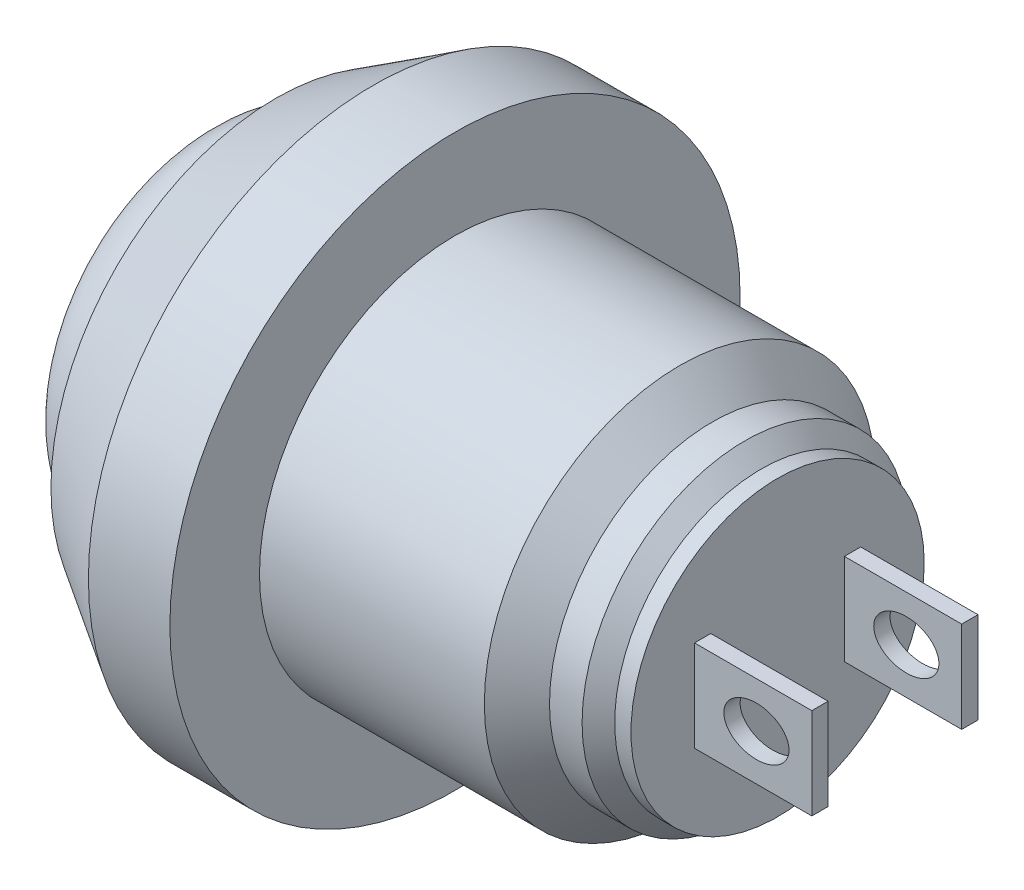
ISO-10303-21;
HEADER;
FILE_DESCRIPTION(('STEP AP214'),'2;1');
FILE_NAME('part.step','',(''),(''),'','','');
FILE_SCHEMA(('AUTOMOTIVE_DESIGN { 1 0 10303 214 1 1 1 1 }'));
ENDSEC;
DATA;
#1=APPLICATION_CONTEXT('core data for automotive mechanical design processes');
#2=APPLICATION_PROTOCOL_DEFINITION('international standard','automotive_design',2000,#1);
#3=PRODUCT_CONTEXT('',#1,'mechanical');
#4=PRODUCT('Part','Part','',(#3));
#5=PRODUCT_RELATED_PRODUCT_CATEGORY('part','',(#4));
#6=PRODUCT_DEFINITION_FORMATION('','',#4);
#7=PRODUCT_DEFINITION_CONTEXT('part definition',#1,'design');
#8=PRODUCT_DEFINITION('design','',#6,#7);
#9=PRODUCT_DEFINITION_SHAPE('','',#8);
#10=(LENGTH_UNIT() NAMED_UNIT(*) SI_UNIT(.MILLI.,.METRE.));
#11=(NAMED_UNIT(*) PLANE_ANGLE_UNIT() SI_UNIT($,.RADIAN.));
#12=(NAMED_UNIT(*) SI_UNIT($,.STERADIAN.) SOLID_ANGLE_UNIT());
#13=UNCERTAINTY_MEASURE_WITH_UNIT(LENGTH_MEASURE(1.E-05),#10,'distance_accuracy_value','');
#14=(GEOMETRIC_REPRESENTATION_CONTEXT(3) GLOBAL_UNCERTAINTY_ASSIGNED_CONTEXT((#13)) GLOBAL_UNIT_ASSIGNED_CONTEXT((#10,
#11,#12)) REPRESENTATION_CONTEXT('',''));
#15=CARTESIAN_POINT('',(0.,0.,0.));
#16=DIRECTION('',(0.,0.,1.));
#17=DIRECTION('',(1.,0.,0.));
#18=AXIS2_PLACEMENT_3D('',#15,#16,#17);
#19=CARTESIAN_POINT('',(9.9,0.,-4.5));
#20=DIRECTION('',(1.,0.,0.));
#21=DIRECTION('',(0.,0.,-1.));
#22=AXIS2_PLACEMENT_3D('',#19,#20,#21);
#23=PLANE('',#22);
#24=DIRECTION('',(0.,-1.,0.));
#25=VECTOR('',#24,1.);
#26=CARTESIAN_POINT('',(9.9,1.4,-2.55));
#27=LINE('',#26,#25);
#28=CARTESIAN_POINT('',(9.9,1.4,-2.55));
#29=VERTEX_POINT('',#28);
#30=CARTESIAN_POINT('',(9.9,-1.4,-2.55));
#31=VERTEX_POINT('',#30);
#32=EDGE_CURVE('E100',#29,#31,#27,.T.);
#33=ORIENTED_EDGE('',*,*,#32,.T.);
#34=DIRECTION('',(0.,0.,1.));
#35=VECTOR('',#34,1.);
#36=CARTESIAN_POINT('',(9.9,-1.4,-2.55));
#37=LINE('',#36,#35);
#38=CARTESIAN_POINT('',(9.9,-1.4,-2.05));
#39=VERTEX_POINT('',#38);
#40=EDGE_CURVE('E475',#31,#39,#37,.T.);
#41=ORIENTED_EDGE('',*,*,#40,.T.);
#42=DIRECTION('',(0.,-1.,0.));
#43=VECTOR('',#42,1.);
#44=CARTESIAN_POINT('',(9.9,1.4,-2.05));
#45=LINE('',#44,#43);
#46=CARTESIAN_POINT('',(9.9,1.4,-2.05));
#47=VERTEX_POINT('',#46);
#48=EDGE_CURVE('E121',#47,#39,#45,.T.);
#49=ORIENTED_EDGE('',*,*,#48,.F.);
#50=DIRECTION('',(0.,0.,1.));
#51=VECTOR('',#50,1.);
#52=CARTESIAN_POINT('',(9.9,1.4,-2.55));
#53=LINE('',#52,#51);
#54=EDGE_CURVE('E115',#29,#47,#53,.T.);
#55=ORIENTED_EDGE('',*,*,#54,.F.);
#56=EDGE_LOOP('',(#33,#41,#49,#55));
#57=FACE_BOUND('',#56,.T.);
#58=CARTESIAN_POINT('',(9.9,0.,0.));
#59=DIRECTION('',(1.,0.,0.));
#60=DIRECTION('',(0.,0.,-1.));
#61=AXIS2_PLACEMENT_3D('',#58,#59,#60);
#62=CIRCLE('',#61,4.5);
#63=CARTESIAN_POINT('',(9.9,0.,-4.5));
#64=VERTEX_POINT('',#63);
#65=EDGE_CURVE('E208',#64,#64,#62,.T.);
#66=ORIENTED_EDGE('',*,*,#65,.T.);
#67=EDGE_LOOP('',(#66));
#68=FACE_BOUND('',#67,.T.);
#69=DIRECTION('',(0.,-1.,0.));
#70=VECTOR('',#69,1.);
#71=CARTESIAN_POINT('',(9.9,1.4,2.05));
#72=LINE('',#71,#70);
#73=CARTESIAN_POINT('',(9.9,1.4,2.05));
#74=VERTEX_POINT('',#73);
#75=CARTESIAN_POINT('',(9.9,-1.4,2.05));
#76=VERTEX_POINT('',#75);
#77=EDGE_CURVE('E55',#74,#76,#72,.T.);
#78=ORIENTED_EDGE('',*,*,#77,.T.);
#79=DIRECTION('',(0.,0.,-1.));
#80=VECTOR('',#79,1.);
#81=CARTESIAN_POINT('',(9.9,-1.4,2.55));
#82=LINE('',#81,#80);
#83=CARTESIAN_POINT('',(9.9,-1.4,2.55));
#84=VERTEX_POINT('',#83);
#85=EDGE_CURVE('E206',#84,#76,#82,.T.);
#86=ORIENTED_EDGE('',*,*,#85,.F.);
#87=DIRECTION('',(0.,-1.,0.));
#88=VECTOR('',#87,1.);
#89=CARTESIAN_POINT('',(9.9,1.4,2.55));
#90=LINE('',#89,#88);
#91=CARTESIAN_POINT('',(9.9,1.4,2.55));
#92=VERTEX_POINT('',#91);
#93=EDGE_CURVE('E277',#92,#84,#90,.T.);
#94=ORIENTED_EDGE('',*,*,#93,.F.);
#95=DIRECTION('',(0.,0.,-1.));
#96=VECTOR('',#95,1.);
#97=CARTESIAN_POINT('',(9.9,1.4,2.55));
#98=LINE('',#97,#96);
#99=EDGE_CURVE('E265',#92,#74,#98,.T.);
#100=ORIENTED_EDGE('',*,*,#99,.T.);
#101=EDGE_LOOP('',(#78,#86,#94,#100));
#102=FACE_BOUND('',#101,.T.);
#103=ADVANCED_FACE('F33',(#57,#68,#102),#23,.T.);
#104=CARTESIAN_POINT('',(-8.1,0.,0.));
#105=DIRECTION('',(-1.,0.,0.));
#106=DIRECTION('',(0.,0.,1.));
#107=AXIS2_PLACEMENT_3D('',#104,#105,#106);
#108=PLANE('',#107);
#109=CARTESIAN_POINT('',(-8.1,0.,0.));
#110=DIRECTION('',(1.,0.,0.));
#111=DIRECTION('',(0.,0.,-1.));
#112=AXIS2_PLACEMENT_3D('',#109,#110,#111);
#113=CIRCLE('',#112,3.);
#114=CARTESIAN_POINT('',(-8.1,0.,-3.));
#115=VERTEX_POINT('',#114);
#116=EDGE_CURVE('E11',#115,#115,#113,.T.);
#117=ORIENTED_EDGE('',*,*,#116,.F.);
#118=EDGE_LOOP('',(#117));
#119=FACE_BOUND('',#118,.T.);
#120=ADVANCED_FACE('F199',(#119),#108,.T.);
#121=CARTESIAN_POINT('',(-5.5,0.,-5.9));
#122=CARTESIAN_POINT('',(-6.43649262733683,0.,-5.9));
#123=CARTESIAN_POINT('',(-8.1,0.,-5.49436582773156));
#124=CARTESIAN_POINT('',(-8.1,0.,-3.));
#125=B_SPLINE_CURVE_WITH_KNOTS('',3,(#121,#122,#123,#124),.UNSPECIFIED.,.F.,.F.,(4,4),(0.,1.),.UNSPECIFIED.);
#126=CARTESIAN_POINT('',(0.,0.,0.));
#127=DIRECTION('',(1.,0.,0.));
#128=AXIS1_PLACEMENT('',#126,#127);
#129=SURFACE_OF_REVOLUTION('',#125,#128);
#130=ORIENTED_EDGE('',*,*,#116,.T.);
#131=EDGE_LOOP('',(#130));
#132=FACE_BOUND('',#131,.T.);
#133=CARTESIAN_POINT('',(-5.5,0.,0.));
#134=DIRECTION('',(1.,0.,0.));
#135=DIRECTION('',(0.,0.,-1.));
#136=AXIS2_PLACEMENT_3D('',#133,#134,#135);
#137=CIRCLE('',#136,5.9);
#138=CARTESIAN_POINT('',(-5.5,0.,-5.9));
#139=VERTEX_POINT('',#138);
#140=EDGE_CURVE('E40',#139,#139,#137,.T.);
#141=ORIENTED_EDGE('',*,*,#140,.F.);
#142=EDGE_LOOP('',(#141));
#143=FACE_BOUND('',#142,.T.);
#144=ADVANCED_FACE('F195',(#132,#143),#129,.F.);
#145=CARTESIAN_POINT('',(-5.5,0.,-6.9));
#146=DIRECTION('',(-1.,0.,0.));
#147=DIRECTION('',(0.,0.,1.));
#148=AXIS2_PLACEMENT_3D('',#145,#146,#147);
#149=PLANE('',#148);
#150=ORIENTED_EDGE('',*,*,#140,.T.);
#151=EDGE_LOOP('',(#150));
#152=FACE_BOUND('',#151,.T.);
#153=CARTESIAN_POINT('',(-5.5,0.,0.));
#154=DIRECTION('',(1.,0.,0.));
#155=DIRECTION('',(0.,0.,-1.));
#156=AXIS2_PLACEMENT_3D('',#153,#154,#155);
#157=CIRCLE('',#156,6.9);
#158=CARTESIAN_POINT('',(-5.5,0.,-6.9));
#159=VERTEX_POINT('',#158);
#160=EDGE_CURVE('E235',#159,#159,#157,.T.);
#161=ORIENTED_EDGE('',*,*,#160,.F.);
#162=EDGE_LOOP('',(#161));
#163=FACE_BOUND('',#162,.T.);
#164=ADVANCED_FACE('F191',(#152,#163),#149,.T.);
#165=CARTESIAN_POINT('',(-2.5,0.,0.));
#166=DIRECTION('',(1.,0.,0.));
#167=DIRECTION('',(0.,0.,-1.));
#168=AXIS2_PLACEMENT_3D('',#165,#166,#167);
#169=CONICAL_SURFACE('',#168,8.75,0.552584350290714);
#170=ORIENTED_EDGE('',*,*,#160,.T.);
#171=EDGE_LOOP('',(#170));
#172=FACE_BOUND('',#171,.T.);
#173=CARTESIAN_POINT('',(-2.5,0.,0.));
#174=DIRECTION('',(1.,0.,0.));
#175=DIRECTION('',(0.,0.,-1.));
#176=AXIS2_PLACEMENT_3D('',#173,#174,#175);
#177=CIRCLE('',#176,8.75);
#178=CARTESIAN_POINT('',(-2.5,0.,-8.75));
#179=VERTEX_POINT('',#178);
#180=EDGE_CURVE('E232',#179,#179,#177,.T.);
#181=ORIENTED_EDGE('',*,*,#180,.F.);
#182=EDGE_LOOP('',(#181));
#183=FACE_BOUND('',#182,.T.);
#184=ADVANCED_FACE('F187',(#172,#183),#169,.T.);
#185=CARTESIAN_POINT('',(0.,0.,0.));
#186=DIRECTION('',(1.,0.,0.));
#187=DIRECTION('',(0.,0.,-1.));
#188=AXIS2_PLACEMENT_3D('',#185,#186,#187);
#189=CYLINDRICAL_SURFACE('',#188,8.75);
#190=ORIENTED_EDGE('',*,*,#180,.T.);
#191=EDGE_LOOP('',(#190));
#192=FACE_BOUND('',#191,.T.);
#193=CARTESIAN_POINT('',(0.,0.,0.));
#194=DIRECTION('',(1.,0.,0.));
#195=DIRECTION('',(0.,0.,-1.));
#196=AXIS2_PLACEMENT_3D('',#193,#194,#195);
#197=CIRCLE('',#196,8.75);
#198=CARTESIAN_POINT('',(0.,0.,-8.75));
#199=VERTEX_POINT('',#198);
#200=EDGE_CURVE('E229',#199,#199,#197,.T.);
#201=ORIENTED_EDGE('',*,*,#200,.F.);
#202=EDGE_LOOP('',(#201));
#203=FACE_BOUND('',#202,.T.);
#204=ADVANCED_FACE('F183',(#192,#203),#189,.T.);
#205=CARTESIAN_POINT('',(0.,0.,-8.75));
#206=DIRECTION('',(1.,0.,0.));
#207=DIRECTION('',(0.,0.,-1.));
#208=AXIS2_PLACEMENT_3D('',#205,#206,#207);
#209=PLANE('',#208);
#210=ORIENTED_EDGE('',*,*,#200,.T.);
#211=EDGE_LOOP('',(#210));
#212=FACE_BOUND('',#211,.T.);
#213=CARTESIAN_POINT('',(0.,0.,0.));
#214=DIRECTION('',(1.,0.,0.));
#215=DIRECTION('',(0.,0.,-1.));
#216=AXIS2_PLACEMENT_3D('',#213,#214,#215);
#217=CIRCLE('',#216,6.);
#218=CARTESIAN_POINT('',(0.,0.,-6.));
#219=VERTEX_POINT('',#218);
#220=EDGE_CURVE('E226',#219,#219,#217,.T.);
#221=ORIENTED_EDGE('',*,*,#220,.F.);
#222=EDGE_LOOP('',(#221));
#223=FACE_BOUND('',#222,.T.);
#224=ADVANCED_FACE('F179',(#212,#223),#209,.T.);
#225=CARTESIAN_POINT('',(0.,0.,0.));
#226=DIRECTION('',(1.,0.,0.));
#227=DIRECTION('',(0.,0.,-1.));
#228=AXIS2_PLACEMENT_3D('',#225,#226,#227);
#229=CYLINDRICAL_SURFACE('',#228,6.);
#230=ORIENTED_EDGE('',*,*,#220,.T.);
#231=EDGE_LOOP('',(#230));
#232=FACE_BOUND('',#231,.T.);
#233=CARTESIAN_POINT('',(6.89999999999999,0.,0.));
#234=DIRECTION('',(1.,0.,0.));
#235=DIRECTION('',(0.,0.,-1.));
#236=AXIS2_PLACEMENT_3D('',#233,#234,#235);
#237=CIRCLE('',#236,6.);
#238=CARTESIAN_POINT('',(6.89999999999999,0.,-6.));
#239=VERTEX_POINT('',#238);
#240=EDGE_CURVE('E223',#239,#239,#237,.T.);
#241=ORIENTED_EDGE('',*,*,#240,.F.);
#242=EDGE_LOOP('',(#241));
#243=FACE_BOUND('',#242,.T.);
#244=ADVANCED_FACE('F175',(#232,#243),#229,.T.);
#245=CARTESIAN_POINT('',(7.89999999999999,0.,0.));
#246=DIRECTION('',(-1.,0.,0.));
#247=DIRECTION('',(0.,0.,1.));
#248=AXIS2_PLACEMENT_3D('',#245,#246,#247);
#249=CONICAL_SURFACE('',#248,5.,0.785398163397444);
#250=ORIENTED_EDGE('',*,*,#240,.T.);
#251=EDGE_LOOP('',(#250));
#252=FACE_BOUND('',#251,.T.);
#253=CARTESIAN_POINT('',(7.89999999999999,0.,0.));
#254=DIRECTION('',(1.,0.,0.));
#255=DIRECTION('',(0.,0.,-1.));
#256=AXIS2_PLACEMENT_3D('',#253,#254,#255);
#257=CIRCLE('',#256,5.);
#258=CARTESIAN_POINT('',(7.89999999999999,0.,-5.));
#259=VERTEX_POINT('',#258);
#260=EDGE_CURVE('E220',#259,#259,#257,.T.);
#261=ORIENTED_EDGE('',*,*,#260,.F.);
#262=EDGE_LOOP('',(#261));
#263=FACE_BOUND('',#262,.T.);
#264=ADVANCED_FACE('F171',(#252,#263),#249,.T.);
#265=CARTESIAN_POINT('',(0.,0.,0.));
#266=DIRECTION('',(1.,0.,0.));
#267=DIRECTION('',(0.,0.,-1.));
#268=AXIS2_PLACEMENT_3D('',#265,#266,#267);
#269=CYLINDRICAL_SURFACE('',#268,5.);
#270=ORIENTED_EDGE('',*,*,#260,.T.);
#271=EDGE_LOOP('',(#270));
#272=FACE_BOUND('',#271,.T.);
#273=CARTESIAN_POINT('',(8.9,0.,0.));
#274=DIRECTION('',(1.,0.,0.));
#275=DIRECTION('',(0.,0.,-1.));
#276=AXIS2_PLACEMENT_3D('',#273,#274,#275);
#277=CIRCLE('',#276,5.);
#278=CARTESIAN_POINT('',(8.9,0.,-5.));
#279=VERTEX_POINT('',#278);
#280=EDGE_CURVE('E217',#279,#279,#277,.T.);
#281=ORIENTED_EDGE('',*,*,#280,.F.);
#282=EDGE_LOOP('',(#281));
#283=FACE_BOUND('',#282,.T.);
#284=ADVANCED_FACE('F167',(#272,#283),#269,.T.);
#285=CARTESIAN_POINT('',(9.4,0.,0.));
#286=DIRECTION('',(-1.,0.,0.));
#287=DIRECTION('',(0.,0.,1.));
#288=AXIS2_PLACEMENT_3D('',#285,#286,#287);
#289=CONICAL_SURFACE('',#288,4.5,0.785398163397443);
#290=ORIENTED_EDGE('',*,*,#280,.T.);
#291=EDGE_LOOP('',(#290));
#292=FACE_BOUND('',#291,.T.);
#293=CARTESIAN_POINT('',(9.4,0.,0.));
#294=DIRECTION('',(1.,0.,0.));
#295=DIRECTION('',(0.,0.,-1.));
#296=AXIS2_PLACEMENT_3D('',#293,#294,#295);
#297=CIRCLE('',#296,4.5);
#298=CARTESIAN_POINT('',(9.4,0.,-4.5));
#299=VERTEX_POINT('',#298);
#300=EDGE_CURVE('E214',#299,#299,#297,.T.);
#301=ORIENTED_EDGE('',*,*,#300,.F.);
#302=EDGE_LOOP('',(#301));
#303=FACE_BOUND('',#302,.T.);
#304=ADVANCED_FACE('F163',(#292,#303),#289,.T.);
#305=CARTESIAN_POINT('',(0.,0.,0.));
#306=DIRECTION('',(1.,0.,0.));
#307=DIRECTION('',(0.,0.,-1.));
#308=AXIS2_PLACEMENT_3D('',#305,#306,#307);
#309=CYLINDRICAL_SURFACE('',#308,4.5);
#310=ORIENTED_EDGE('',*,*,#300,.T.);
#311=EDGE_LOOP('',(#310));
#312=FACE_BOUND('',#311,.T.);
#313=ORIENTED_EDGE('',*,*,#65,.F.);
#314=EDGE_LOOP('',(#313));
#315=FACE_BOUND('',#314,.T.);
#316=ADVANCED_FACE('F146',(#312,#315),#309,.T.);
#317=CARTESIAN_POINT('',(0.,0.,2.55));
#318=DIRECTION('',(0.,0.,1.));
#319=DIRECTION('',(1.,0.,0.));
#320=AXIS2_PLACEMENT_3D('',#317,#318,#319);
#321=PLANE('',#320);
#322=ORIENTED_EDGE('',*,*,#93,.T.);
#323=DIRECTION('',(1.,0.,0.));
#324=VECTOR('',#323,1.);
#325=CARTESIAN_POINT('',(9.9,-1.4,2.55));
#326=LINE('',#325,#324);
#327=CARTESIAN_POINT('',(13.5,-1.4,2.55));
#328=VERTEX_POINT('',#327);
#329=EDGE_CURVE('E286',#84,#328,#326,.T.);
#330=ORIENTED_EDGE('',*,*,#329,.T.);
#331=DIRECTION('',(0.,1.,0.));
#332=VECTOR('',#331,1.);
#333=CARTESIAN_POINT('',(13.5,1.4,2.55));
#334=LINE('',#333,#332);
#335=CARTESIAN_POINT('',(13.5,1.4,2.55));
#336=VERTEX_POINT('',#335);
#337=EDGE_CURVE('E288',#328,#336,#334,.T.);
#338=ORIENTED_EDGE('',*,*,#337,.T.);
#339=DIRECTION('',(-1.,0.,0.));
#340=VECTOR('',#339,1.);
#341=CARTESIAN_POINT('',(9.9,1.4,2.55));
#342=LINE('',#341,#340);
#343=EDGE_CURVE('E271',#336,#92,#342,.T.);
#344=ORIENTED_EDGE('',*,*,#343,.T.);
#345=EDGE_LOOP('',(#322,#330,#338,#344));
#346=FACE_BOUND('',#345,.T.);
#347=CARTESIAN_POINT('',(11.8,0.,2.55));
#348=DIRECTION('',(0.,0.,1.));
#349=DIRECTION('',(1.,0.,0.));
#350=AXIS2_PLACEMENT_3D('',#347,#348,#349);
#351=ELLIPSE('',#350,1.,0.75);
#352=CARTESIAN_POINT('',(12.8,0.,2.55));
#353=VERTEX_POINT('',#352);
#354=EDGE_CURVE('E125',#353,#353,#351,.T.);
#355=ORIENTED_EDGE('',*,*,#354,.F.);
#356=EDGE_LOOP('',(#355));
#357=FACE_BOUND('',#356,.T.);
#358=ADVANCED_FACE('F142',(#346,#357),#321,.T.);
#359=CARTESIAN_POINT('',(0.,0.,2.05));
#360=DIRECTION('',(0.,0.,1.));
#361=DIRECTION('',(1.,0.,0.));
#362=AXIS2_PLACEMENT_3D('',#359,#360,#361);
#363=PLANE('',#362);
#364=ORIENTED_EDGE('',*,*,#77,.F.);
#365=DIRECTION('',(-1.,0.,0.));
#366=VECTOR('',#365,1.);
#367=CARTESIAN_POINT('',(9.9,1.4,2.05));
#368=LINE('',#367,#366);
#369=CARTESIAN_POINT('',(13.5,1.4,2.05));
#370=VERTEX_POINT('',#369);
#371=EDGE_CURVE('E275',#370,#74,#368,.T.);
#372=ORIENTED_EDGE('',*,*,#371,.F.);
#373=DIRECTION('',(0.,1.,0.));
#374=VECTOR('',#373,1.);
#375=CARTESIAN_POINT('',(13.5,1.4,2.05));
#376=LINE('',#375,#374);
#377=CARTESIAN_POINT('',(13.5,-1.4,2.05));
#378=VERTEX_POINT('',#377);
#379=EDGE_CURVE('E268',#378,#370,#376,.T.);
#380=ORIENTED_EDGE('',*,*,#379,.F.);
#381=DIRECTION('',(1.,0.,0.));
#382=VECTOR('',#381,1.);
#383=CARTESIAN_POINT('',(9.9,-1.4,2.05));
#384=LINE('',#383,#382);
#385=EDGE_CURVE('E266',#76,#378,#384,.T.);
#386=ORIENTED_EDGE('',*,*,#385,.F.);
#387=EDGE_LOOP('',(#364,#372,#380,#386));
#388=FACE_BOUND('',#387,.T.);
#389=CARTESIAN_POINT('',(11.8,0.,2.05));
#390=DIRECTION('',(0.,0.,1.));
#391=DIRECTION('',(1.,0.,0.));
#392=AXIS2_PLACEMENT_3D('',#389,#390,#391);
#393=ELLIPSE('',#392,1.,0.75);
#394=CARTESIAN_POINT('',(12.8,0.,2.05));
#395=VERTEX_POINT('',#394);
#396=EDGE_CURVE('E122',#395,#395,#393,.T.);
#397=ORIENTED_EDGE('',*,*,#396,.T.);
#398=EDGE_LOOP('',(#397));
#399=FACE_BOUND('',#398,.T.);
#400=ADVANCED_FACE('F145',(#388,#399),#363,.F.);
#401=CARTESIAN_POINT('',(9.9,-1.4,2.55));
#402=DIRECTION('',(0.,1.,0.));
#403=DIRECTION('',(0.,0.,1.));
#404=AXIS2_PLACEMENT_3D('',#401,#402,#403);
#405=PLANE('',#404);
#406=ORIENTED_EDGE('',*,*,#385,.T.);
#407=DIRECTION('',(0.,0.,-1.));
#408=VECTOR('',#407,1.);
#409=CARTESIAN_POINT('',(13.5,-1.4,2.55));
#410=LINE('',#409,#408);
#411=EDGE_CURVE('E281',#328,#378,#410,.T.);
#412=ORIENTED_EDGE('',*,*,#411,.F.);
#413=ORIENTED_EDGE('',*,*,#329,.F.);
#414=ORIENTED_EDGE('',*,*,#85,.T.);
#415=EDGE_LOOP('',(#406,#412,#413,#414));
#416=FACE_BOUND('',#415,.T.);
#417=ADVANCED_FACE('F150',(#416),#405,.F.);
#418=CARTESIAN_POINT('',(13.5,1.4,2.55));
#419=DIRECTION('',(-1.,0.,0.));
#420=DIRECTION('',(0.,0.,1.));
#421=AXIS2_PLACEMENT_3D('',#418,#419,#420);
#422=PLANE('',#421);
#423=ORIENTED_EDGE('',*,*,#379,.T.);
#424=DIRECTION('',(0.,0.,-1.));
#425=VECTOR('',#424,1.);
#426=CARTESIAN_POINT('',(13.5,1.4,2.55));
#427=LINE('',#426,#425);
#428=EDGE_CURVE('E279',#336,#370,#427,.T.);
#429=ORIENTED_EDGE('',*,*,#428,.F.);
#430=ORIENTED_EDGE('',*,*,#337,.F.);
#431=ORIENTED_EDGE('',*,*,#411,.T.);
#432=EDGE_LOOP('',(#423,#429,#430,#431));
#433=FACE_BOUND('',#432,.T.);
#434=ADVANCED_FACE('F153',(#433),#422,.F.);
#435=CARTESIAN_POINT('',(9.9,1.4,2.55));
#436=DIRECTION('',(0.,-1.,0.));
#437=DIRECTION('',(1.,0.,0.));
#438=AXIS2_PLACEMENT_3D('',#435,#436,#437);
#439=PLANE('',#438);
#440=ORIENTED_EDGE('',*,*,#371,.T.);
#441=ORIENTED_EDGE('',*,*,#99,.F.);
#442=ORIENTED_EDGE('',*,*,#343,.F.);
#443=ORIENTED_EDGE('',*,*,#428,.T.);
#444=EDGE_LOOP('',(#440,#441,#442,#443));
#445=FACE_BOUND('',#444,.T.);
#446=ADVANCED_FACE('F139',(#445),#439,.F.);
#447=DIRECTION('',(0.,0.,-1.));
#448=VECTOR('',#447,1.);
#449=SURFACE_OF_LINEAR_EXTRUSION('',#351,#448);
#450=ORIENTED_EDGE('',*,*,#354,.T.);
#451=EDGE_LOOP('',(#450));
#452=FACE_BOUND('',#451,.T.);
#453=ORIENTED_EDGE('',*,*,#396,.F.);
#454=EDGE_LOOP('',(#453));
#455=FACE_BOUND('',#454,.T.);
#456=ADVANCED_FACE('F135',(#452,#455),#449,.T.);
#457=CARTESIAN_POINT('',(9.9,1.4,-2.55));
#458=DIRECTION('',(0.,1.,0.));
#459=DIRECTION('',(-1.,0.,0.));
#460=AXIS2_PLACEMENT_3D('',#457,#458,#459);
#461=PLANE('',#460);
#462=DIRECTION('',(-1.,0.,0.));
#463=VECTOR('',#462,1.);
#464=CARTESIAN_POINT('',(9.9,1.4,-2.05));
#465=LINE('',#464,#463);
#466=CARTESIAN_POINT('',(13.5,1.4,-2.05));
#467=VERTEX_POINT('',#466);
#468=EDGE_CURVE('E47',#467,#47,#465,.T.);
#469=ORIENTED_EDGE('',*,*,#468,.F.);
#470=DIRECTION('',(0.,0.,1.));
#471=VECTOR('',#470,1.);
#472=CARTESIAN_POINT('',(13.5,1.4,-2.55));
#473=LINE('',#472,#471);
#474=CARTESIAN_POINT('',(13.5,1.4,-2.55));
#475=VERTEX_POINT('',#474);
#476=EDGE_CURVE('E117',#475,#467,#473,.T.);
#477=ORIENTED_EDGE('',*,*,#476,.F.);
#478=DIRECTION('',(-1.,0.,0.));
#479=VECTOR('',#478,1.);
#480=CARTESIAN_POINT('',(9.9,1.4,-2.55));
#481=LINE('',#480,#479);
#482=EDGE_CURVE('E104',#475,#29,#481,.T.);
#483=ORIENTED_EDGE('',*,*,#482,.T.);
#484=ORIENTED_EDGE('',*,*,#54,.T.);
#485=EDGE_LOOP('',(#469,#477,#483,#484));
#486=FACE_BOUND('',#485,.T.);
#487=ADVANCED_FACE('F114',(#486),#461,.T.);
#488=CARTESIAN_POINT('',(13.5,1.4,-2.55));
#489=DIRECTION('',(1.,0.,0.));
#490=DIRECTION('',(0.,0.,-1.));
#491=AXIS2_PLACEMENT_3D('',#488,#489,#490);
#492=PLANE('',#491);
#493=DIRECTION('',(0.,1.,0.));
#494=VECTOR('',#493,1.);
#495=CARTESIAN_POINT('',(13.5,1.4,-2.05));
#496=LINE('',#495,#494);
#497=CARTESIAN_POINT('',(13.5,-1.4,-2.05));
#498=VERTEX_POINT('',#497);
#499=EDGE_CURVE('E478',#498,#467,#496,.T.);
#500=ORIENTED_EDGE('',*,*,#499,.F.);
#501=DIRECTION('',(0.,0.,1.));
#502=VECTOR('',#501,1.);
#503=CARTESIAN_POINT('',(13.5,-1.4,-2.55));
#504=LINE('',#503,#502);
#505=CARTESIAN_POINT('',(13.5,-1.4,-2.55));
#506=VERTEX_POINT('',#505);
#507=EDGE_CURVE('E127',#506,#498,#504,.T.);
#508=ORIENTED_EDGE('',*,*,#507,.F.);
#509=DIRECTION('',(0.,1.,0.));
#510=VECTOR('',#509,1.);
#511=CARTESIAN_POINT('',(13.5,1.4,-2.55));
#512=LINE('',#511,#510);
#513=EDGE_CURVE('E118',#506,#475,#512,.T.);
#514=ORIENTED_EDGE('',*,*,#513,.T.);
#515=ORIENTED_EDGE('',*,*,#476,.T.);
#516=EDGE_LOOP('',(#500,#508,#514,#515));
#517=FACE_BOUND('',#516,.T.);
#518=ADVANCED_FACE('F374',(#517),#492,.T.);
#519=CARTESIAN_POINT('',(9.9,-1.4,-2.55));
#520=DIRECTION('',(0.,-1.,0.));
#521=DIRECTION('',(0.,0.,-1.));
#522=AXIS2_PLACEMENT_3D('',#519,#520,#521);
#523=PLANE('',#522);
#524=DIRECTION('',(1.,0.,0.));
#525=VECTOR('',#524,1.);
#526=CARTESIAN_POINT('',(9.9,-1.4,-2.05));
#527=LINE('',#526,#525);
#528=EDGE_CURVE('E111',#39,#498,#527,.T.);
#529=ORIENTED_EDGE('',*,*,#528,.F.);
#530=ORIENTED_EDGE('',*,*,#40,.F.);
#531=DIRECTION('',(1.,0.,0.));
#532=VECTOR('',#531,1.);
#533=CARTESIAN_POINT('',(9.9,-1.4,-2.55));
#534=LINE('',#533,#532);
#535=EDGE_CURVE('E107',#31,#506,#534,.T.);
#536=ORIENTED_EDGE('',*,*,#535,.T.);
#537=ORIENTED_EDGE('',*,*,#507,.T.);
#538=EDGE_LOOP('',(#529,#530,#536,#537));
#539=FACE_BOUND('',#538,.T.);
#540=ADVANCED_FACE('F380',(#539),#523,.T.);
#541=CARTESIAN_POINT('',(0.,0.,-2.55));
#542=DIRECTION('',(0.,0.,-1.));
#543=DIRECTION('',(1.,0.,0.));
#544=AXIS2_PLACEMENT_3D('',#541,#542,#543);
#545=PLANE('',#544);
#546=CARTESIAN_POINT('',(11.8,0.,-2.55));
#547=DIRECTION('',(0.,0.,1.));
#548=DIRECTION('',(1.,0.,0.));
#549=AXIS2_PLACEMENT_3D('',#546,#547,#548);
#550=ELLIPSE('',#549,1.,0.75);
#551=CARTESIAN_POINT('',(12.8,0.,-2.55));
#552=VERTEX_POINT('',#551);
#553=EDGE_CURVE('E466',#552,#552,#550,.T.);
#554=ORIENTED_EDGE('',*,*,#553,.T.);
#555=EDGE_LOOP('',(#554));
#556=FACE_BOUND('',#555,.T.);
#557=ORIENTED_EDGE('',*,*,#32,.F.);
#558=ORIENTED_EDGE('',*,*,#482,.F.);
#559=ORIENTED_EDGE('',*,*,#513,.F.);
#560=ORIENTED_EDGE('',*,*,#535,.F.);
#561=EDGE_LOOP('',(#557,#558,#559,#560));
#562=FACE_BOUND('',#561,.T.);
#563=ADVANCED_FACE('F102',(#556,#562),#545,.T.);
#564=CARTESIAN_POINT('',(0.,0.,-2.05));
#565=DIRECTION('',(0.,0.,-1.));
#566=DIRECTION('',(1.,0.,0.));
#567=AXIS2_PLACEMENT_3D('',#564,#565,#566);
#568=PLANE('',#567);
#569=CARTESIAN_POINT('',(11.8,0.,-2.05));
#570=DIRECTION('',(0.,0.,1.));
#571=DIRECTION('',(1.,0.,0.));
#572=AXIS2_PLACEMENT_3D('',#569,#570,#571);
#573=ELLIPSE('',#572,1.,0.75);
#574=CARTESIAN_POINT('',(12.8,0.,-2.05));
#575=VERTEX_POINT('',#574);
#576=EDGE_CURVE('E470',#575,#575,#573,.T.);
#577=ORIENTED_EDGE('',*,*,#576,.F.);
#578=EDGE_LOOP('',(#577));
#579=FACE_BOUND('',#578,.T.);
#580=ORIENTED_EDGE('',*,*,#48,.T.);
#581=ORIENTED_EDGE('',*,*,#528,.T.);
#582=ORIENTED_EDGE('',*,*,#499,.T.);
#583=ORIENTED_EDGE('',*,*,#468,.T.);
#584=EDGE_LOOP('',(#580,#581,#582,#583));
#585=FACE_BOUND('',#584,.T.);
#586=ADVANCED_FACE('F394',(#579,#585),#568,.F.);
#587=DIRECTION('',(0.,0.,1.));
#588=VECTOR('',#587,1.);
#589=SURFACE_OF_LINEAR_EXTRUSION('',#550,#588);
#590=ORIENTED_EDGE('',*,*,#553,.F.);
#591=EDGE_LOOP('',(#590));
#592=FACE_BOUND('',#591,.T.);
#593=ORIENTED_EDGE('',*,*,#576,.T.);
#594=EDGE_LOOP('',(#593));
#595=FACE_BOUND('',#594,.T.);
#596=ADVANCED_FACE('F402',(#592,#595),#589,.F.);
#597=CLOSED_SHELL('',(#103,#120,#144,#164,#184,#204,#224,#244,#264,#284,#304,#316,#358,#400,
#417,#434,#446,#456,#487,#518,#540,#563,#586,#596));
#598=MANIFOLD_SOLID_BREP('B2',#597);
#599=ADVANCED_BREP_SHAPE_REPRESENTATION('',(#18,#598),#14);
#600=SHAPE_DEFINITION_REPRESENTATION(#9,#599);
ENDSEC;
END-ISO-10303-21;
